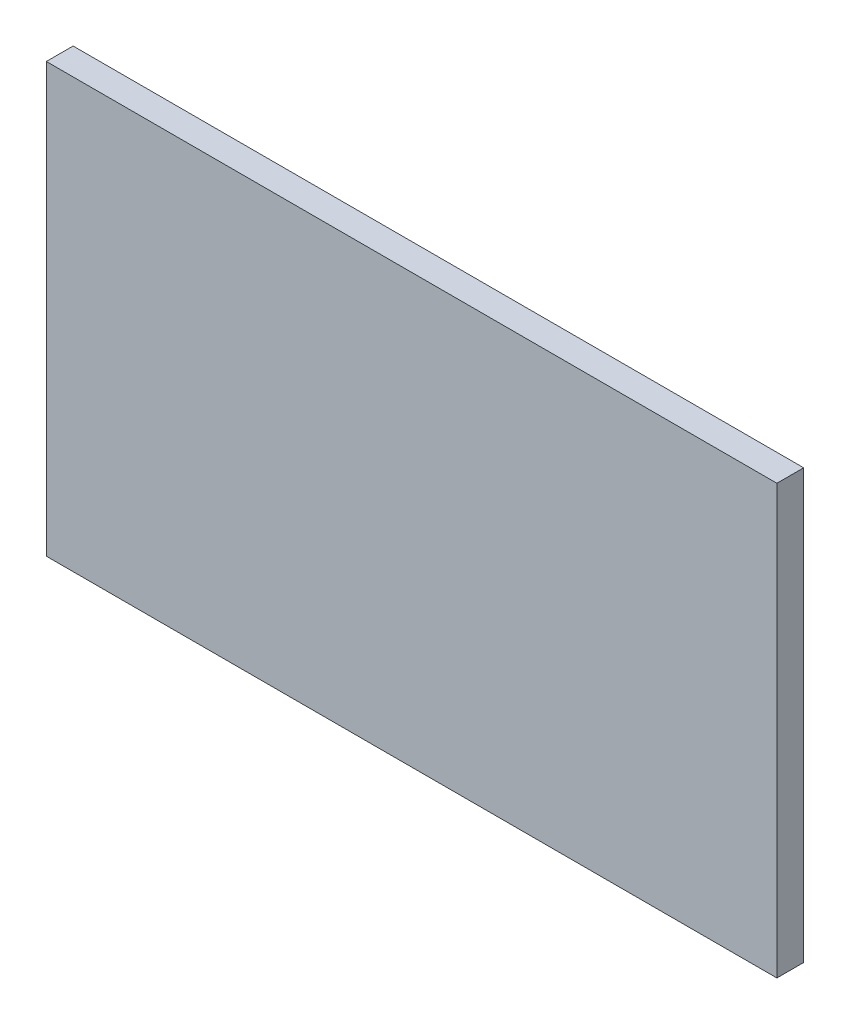
ISO-10303-21;
HEADER;
FILE_DESCRIPTION(('STEP AP214'),'2;1');
FILE_NAME('part.step','',(''),(''),'','','');
FILE_SCHEMA(('AUTOMOTIVE_DESIGN { 1 0 10303 214 1 1 1 1 }'));
ENDSEC;
DATA;
#1=APPLICATION_CONTEXT('core data for automotive mechanical design processes');
#2=APPLICATION_PROTOCOL_DEFINITION('international standard','automotive_design',2000,#1);
#3=PRODUCT_CONTEXT('',#1,'mechanical');
#4=PRODUCT('Part','Part','',(#3));
#5=PRODUCT_RELATED_PRODUCT_CATEGORY('part','',(#4));
#6=PRODUCT_DEFINITION_FORMATION('','',#4);
#7=PRODUCT_DEFINITION_CONTEXT('part definition',#1,'design');
#8=PRODUCT_DEFINITION('design','',#6,#7);
#9=PRODUCT_DEFINITION_SHAPE('','',#8);
#10=(LENGTH_UNIT() NAMED_UNIT(*) SI_UNIT(.MILLI.,.METRE.));
#11=(NAMED_UNIT(*) PLANE_ANGLE_UNIT() SI_UNIT($,.RADIAN.));
#12=(NAMED_UNIT(*) SI_UNIT($,.STERADIAN.) SOLID_ANGLE_UNIT());
#13=UNCERTAINTY_MEASURE_WITH_UNIT(LENGTH_MEASURE(1.E-05),#10,'distance_accuracy_value','');
#14=(GEOMETRIC_REPRESENTATION_CONTEXT(3) GLOBAL_UNCERTAINTY_ASSIGNED_CONTEXT((#13)) GLOBAL_UNIT_ASSIGNED_CONTEXT((#10,
#11,#12)) REPRESENTATION_CONTEXT('',''));
#15=CARTESIAN_POINT('',(0.,0.,0.));
#16=DIRECTION('',(0.,0.,1.));
#17=DIRECTION('',(1.,0.,0.));
#18=AXIS2_PLACEMENT_3D('',#15,#16,#17);
#19=CARTESIAN_POINT('',(0.,0.,25.));
#20=DIRECTION('',(1.,0.,0.));
#21=DIRECTION('',(0.,1.,0.));
#22=AXIS2_PLACEMENT_3D('',#19,#20,#21);
#23=PLANE('',#22);
#24=DIRECTION('',(0.,-1.,0.));
#25=VECTOR('',#24,1.);
#26=CARTESIAN_POINT('',(0.,0.,0.));
#27=LINE('',#26,#25);
#28=CARTESIAN_POINT('',(-1.11022302462516E-13,400.,0.));
#29=VERTEX_POINT('',#28);
#30=CARTESIAN_POINT('',(0.,0.,0.));
#31=VERTEX_POINT('',#30);
#32=EDGE_CURVE('E96',#29,#31,#27,.T.);
#33=ORIENTED_EDGE('',*,*,#32,.T.);
#34=DIRECTION('',(0.,0.,-1.));
#35=VECTOR('',#34,1.);
#36=CARTESIAN_POINT('',(0.,0.,25.));
#37=LINE('',#36,#35);
#38=CARTESIAN_POINT('',(0.,0.,25.));
#39=VERTEX_POINT('',#38);
#40=EDGE_CURVE('E11',#39,#31,#37,.T.);
#41=ORIENTED_EDGE('',*,*,#40,.F.);
#42=DIRECTION('',(0.,-1.,0.));
#43=VECTOR('',#42,1.);
#44=CARTESIAN_POINT('',(0.,0.,25.));
#45=LINE('',#44,#43);
#46=CARTESIAN_POINT('',(-1.11022302462516E-13,400.,25.));
#47=VERTEX_POINT('',#46);
#48=EDGE_CURVE('E84',#47,#39,#45,.T.);
#49=ORIENTED_EDGE('',*,*,#48,.F.);
#50=DIRECTION('',(0.,0.,-1.));
#51=VECTOR('',#50,1.);
#52=CARTESIAN_POINT('',(-1.11022302462516E-13,400.,25.));
#53=LINE('',#52,#51);
#54=EDGE_CURVE('E92',#47,#29,#53,.T.);
#55=ORIENTED_EDGE('',*,*,#54,.T.);
#56=EDGE_LOOP('',(#33,#41,#49,#55));
#57=FACE_BOUND('',#56,.T.);
#58=ADVANCED_FACE('F33',(#57),#23,.F.);
#59=CARTESIAN_POINT('',(0.,0.,25.));
#60=DIRECTION('',(0.,1.,0.));
#61=DIRECTION('',(0.,0.,1.));
#62=AXIS2_PLACEMENT_3D('',#59,#60,#61);
#63=PLANE('',#62);
#64=DIRECTION('',(1.,0.,0.));
#65=VECTOR('',#64,1.);
#66=CARTESIAN_POINT('',(0.,0.,0.));
#67=LINE('',#66,#65);
#68=CARTESIAN_POINT('',(682.,0.,0.));
#69=VERTEX_POINT('',#68);
#70=EDGE_CURVE('E88',#31,#69,#67,.T.);
#71=ORIENTED_EDGE('',*,*,#70,.T.);
#72=DIRECTION('',(0.,0.,-1.));
#73=VECTOR('',#72,1.);
#74=CARTESIAN_POINT('',(682.,0.,25.));
#75=LINE('',#74,#73);
#76=CARTESIAN_POINT('',(682.,0.,25.));
#77=VERTEX_POINT('',#76);
#78=EDGE_CURVE('E41',#77,#69,#75,.T.);
#79=ORIENTED_EDGE('',*,*,#78,.F.);
#80=DIRECTION('',(1.,0.,0.));
#81=VECTOR('',#80,1.);
#82=CARTESIAN_POINT('',(0.,0.,25.));
#83=LINE('',#82,#81);
#84=EDGE_CURVE('E79',#39,#77,#83,.T.);
#85=ORIENTED_EDGE('',*,*,#84,.F.);
#86=ORIENTED_EDGE('',*,*,#40,.T.);
#87=EDGE_LOOP('',(#71,#79,#85,#86));
#88=FACE_BOUND('',#87,.T.);
#89=ADVANCED_FACE('F87',(#88),#63,.F.);
#90=CARTESIAN_POINT('',(682.,0.,25.));
#91=DIRECTION('',(-1.,0.,0.));
#92=DIRECTION('',(0.,-1.,0.));
#93=AXIS2_PLACEMENT_3D('',#90,#91,#92);
#94=PLANE('',#93);
#95=DIRECTION('',(0.,1.,0.));
#96=VECTOR('',#95,1.);
#97=CARTESIAN_POINT('',(682.,0.,0.));
#98=LINE('',#97,#96);
#99=CARTESIAN_POINT('',(682.,400.,0.));
#100=VERTEX_POINT('',#99);
#101=EDGE_CURVE('E66',#69,#100,#98,.T.);
#102=ORIENTED_EDGE('',*,*,#101,.T.);
#103=DIRECTION('',(0.,0.,-1.));
#104=VECTOR('',#103,1.);
#105=CARTESIAN_POINT('',(682.,400.,25.));
#106=LINE('',#105,#104);
#107=CARTESIAN_POINT('',(682.,400.,25.));
#108=VERTEX_POINT('',#107);
#109=EDGE_CURVE('E89',#108,#100,#106,.T.);
#110=ORIENTED_EDGE('',*,*,#109,.F.);
#111=DIRECTION('',(0.,1.,0.));
#112=VECTOR('',#111,1.);
#113=CARTESIAN_POINT('',(682.,0.,25.));
#114=LINE('',#113,#112);
#115=EDGE_CURVE('E82',#77,#108,#114,.T.);
#116=ORIENTED_EDGE('',*,*,#115,.F.);
#117=ORIENTED_EDGE('',*,*,#78,.T.);
#118=EDGE_LOOP('',(#102,#110,#116,#117));
#119=FACE_BOUND('',#118,.T.);
#120=ADVANCED_FACE('F90',(#119),#94,.F.);
#121=CARTESIAN_POINT('',(-1.11022302462516E-13,400.,25.));
#122=DIRECTION('',(0.,-1.,0.));
#123=DIRECTION('',(0.,0.,-1.));
#124=AXIS2_PLACEMENT_3D('',#121,#122,#123);
#125=PLANE('',#124);
#126=DIRECTION('',(-1.,0.,0.));
#127=VECTOR('',#126,1.);
#128=CARTESIAN_POINT('',(-1.11022302462516E-13,400.,0.));
#129=LINE('',#128,#127);
#130=EDGE_CURVE('E72',#100,#29,#129,.T.);
#131=ORIENTED_EDGE('',*,*,#130,.T.);
#132=ORIENTED_EDGE('',*,*,#54,.F.);
#133=DIRECTION('',(-1.,0.,0.));
#134=VECTOR('',#133,1.);
#135=CARTESIAN_POINT('',(-1.11022302462516E-13,400.,25.));
#136=LINE('',#135,#134);
#137=EDGE_CURVE('E49',#108,#47,#136,.T.);
#138=ORIENTED_EDGE('',*,*,#137,.F.);
#139=ORIENTED_EDGE('',*,*,#109,.T.);
#140=EDGE_LOOP('',(#131,#132,#138,#139));
#141=FACE_BOUND('',#140,.T.);
#142=ADVANCED_FACE('F103',(#141),#125,.F.);
#143=CARTESIAN_POINT('',(0.,0.,25.));
#144=DIRECTION('',(0.,0.,-1.));
#145=DIRECTION('',(-1.,0.,0.));
#146=AXIS2_PLACEMENT_3D('',#143,#144,#145);
#147=PLANE('',#146);
#148=ORIENTED_EDGE('',*,*,#48,.T.);
#149=ORIENTED_EDGE('',*,*,#84,.T.);
#150=ORIENTED_EDGE('',*,*,#115,.T.);
#151=ORIENTED_EDGE('',*,*,#137,.T.);
#152=EDGE_LOOP('',(#148,#149,#150,#151));
#153=FACE_BOUND('',#152,.T.);
#154=ADVANCED_FACE('F80',(#153),#147,.F.);
#155=CARTESIAN_POINT('',(0.,0.,0.));
#156=DIRECTION('',(0.,0.,-1.));
#157=DIRECTION('',(-1.,0.,0.));
#158=AXIS2_PLACEMENT_3D('',#155,#156,#157);
#159=PLANE('',#158);
#160=ORIENTED_EDGE('',*,*,#32,.F.);
#161=ORIENTED_EDGE('',*,*,#130,.F.);
#162=ORIENTED_EDGE('',*,*,#101,.F.);
#163=ORIENTED_EDGE('',*,*,#70,.F.);
#164=EDGE_LOOP('',(#160,#161,#162,#163));
#165=FACE_BOUND('',#164,.T.);
#166=ADVANCED_FACE('F106',(#165),#159,.T.);
#167=CLOSED_SHELL('',(#58,#89,#120,#142,#154,#166));
#168=MANIFOLD_SOLID_BREP('B2',#167);
#169=ADVANCED_BREP_SHAPE_REPRESENTATION('',(#18,#168),#14);
#170=SHAPE_DEFINITION_REPRESENTATION(#9,#169);
ENDSEC;
END-ISO-10303-21;
